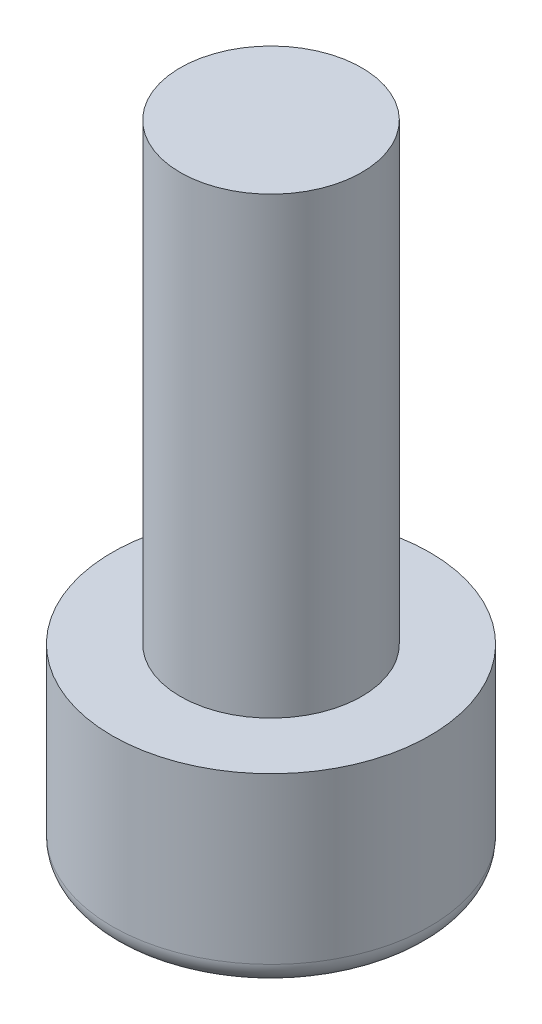
ISO-10303-21;
HEADER;
FILE_DESCRIPTION(('STEP AP214'),'2;1');
FILE_NAME('part.step','',(''),(''),'','','');
FILE_SCHEMA(('AUTOMOTIVE_DESIGN { 1 0 10303 214 1 1 1 1 }'));
ENDSEC;
DATA;
#1=APPLICATION_CONTEXT('core data for automotive mechanical design processes');
#2=APPLICATION_PROTOCOL_DEFINITION('international standard','automotive_design',2000,#1);
#3=PRODUCT_CONTEXT('',#1,'mechanical');
#4=PRODUCT('Part','Part','',(#3));
#5=PRODUCT_RELATED_PRODUCT_CATEGORY('part','',(#4));
#6=PRODUCT_DEFINITION_FORMATION('','',#4);
#7=PRODUCT_DEFINITION_CONTEXT('part definition',#1,'design');
#8=PRODUCT_DEFINITION('design','',#6,#7);
#9=PRODUCT_DEFINITION_SHAPE('','',#8);
#10=(LENGTH_UNIT() NAMED_UNIT(*) SI_UNIT(.MILLI.,.METRE.));
#11=(NAMED_UNIT(*) PLANE_ANGLE_UNIT() SI_UNIT($,.RADIAN.));
#12=(NAMED_UNIT(*) SI_UNIT($,.STERADIAN.) SOLID_ANGLE_UNIT());
#13=UNCERTAINTY_MEASURE_WITH_UNIT(LENGTH_MEASURE(1.E-05),#10,'distance_accuracy_value','');
#14=(GEOMETRIC_REPRESENTATION_CONTEXT(3) GLOBAL_UNCERTAINTY_ASSIGNED_CONTEXT((#13)) GLOBAL_UNIT_ASSIGNED_CONTEXT((#10,
#11,#12)) REPRESENTATION_CONTEXT('',''));
#15=CARTESIAN_POINT('',(0.,0.,0.));
#16=DIRECTION('',(0.,0.,1.));
#17=DIRECTION('',(1.,0.,0.));
#18=AXIS2_PLACEMENT_3D('',#15,#16,#17);
#19=CARTESIAN_POINT('',(0.,4.14,0.));
#20=DIRECTION('',(0.,-1.,0.));
#21=DIRECTION('',(0.,0.,-1.));
#22=AXIS2_PLACEMENT_3D('',#19,#20,#21);
#23=CYLINDRICAL_SURFACE('',#22,3.5);
#24=CARTESIAN_POINT('',(0.,0.5,0.));
#25=DIRECTION('',(0.,1.,0.));
#26=DIRECTION('',(0.,0.,1.));
#27=AXIS2_PLACEMENT_3D('',#24,#25,#26);
#28=CIRCLE('',#27,3.5);
#29=CARTESIAN_POINT('',(0.,0.5,3.5));
#30=VERTEX_POINT('',#29);
#31=EDGE_CURVE('E47',#30,#30,#28,.T.);
#32=ORIENTED_EDGE('',*,*,#31,.T.);
#33=EDGE_LOOP('',(#32));
#34=FACE_BOUND('',#33,.T.);
#35=CARTESIAN_POINT('',(0.,4.14,0.));
#36=DIRECTION('',(0.,1.,0.));
#37=DIRECTION('',(0.,0.,1.));
#38=AXIS2_PLACEMENT_3D('',#35,#36,#37);
#39=CIRCLE('',#38,3.5);
#40=CARTESIAN_POINT('',(0.,4.14,3.5));
#41=VERTEX_POINT('',#40);
#42=EDGE_CURVE('E149',#41,#41,#39,.T.);
#43=ORIENTED_EDGE('',*,*,#42,.F.);
#44=EDGE_LOOP('',(#43));
#45=FACE_BOUND('',#44,.T.);
#46=ADVANCED_FACE('F39',(#34,#45),#23,.T.);
#47=CARTESIAN_POINT('',(0.,4.14,0.));
#48=DIRECTION('',(0.,1.,0.));
#49=DIRECTION('',(0.,0.,1.));
#50=AXIS2_PLACEMENT_3D('',#47,#48,#49);
#51=PLANE('',#50);
#52=CARTESIAN_POINT('',(0.,4.14,0.));
#53=DIRECTION('',(0.,1.,0.));
#54=DIRECTION('',(0.,0.,1.));
#55=AXIS2_PLACEMENT_3D('',#52,#53,#54);
#56=CIRCLE('',#55,2.);
#57=CARTESIAN_POINT('',(0.,4.14,2.));
#58=VERTEX_POINT('',#57);
#59=EDGE_CURVE('E150',#58,#58,#56,.T.);
#60=ORIENTED_EDGE('',*,*,#59,.F.);
#61=EDGE_LOOP('',(#60));
#62=FACE_BOUND('',#61,.T.);
#63=ORIENTED_EDGE('',*,*,#42,.T.);
#64=EDGE_LOOP('',(#63));
#65=FACE_BOUND('',#64,.T.);
#66=ADVANCED_FACE('F174',(#62,#65),#51,.T.);
#67=CARTESIAN_POINT('',(0.,0.,0.));
#68=DIRECTION('',(0.,1.,0.));
#69=DIRECTION('',(0.,0.,1.));
#70=AXIS2_PLACEMENT_3D('',#67,#68,#69);
#71=PLANE('',#70);
#72=DIRECTION('',(-0.986123142284574,0.,0.1660155060553));
#73=VECTOR('',#72,1.);
#74=CARTESIAN_POINT('',(1.69828720758972,0.,2.05607243390784));
#75=LINE('',#74,#73);
#76=CARTESIAN_POINT('',(1.69828720758972,0.,2.05607243390784));
#77=VERTEX_POINT('',#76);
#78=CARTESIAN_POINT('',(-0.931467355990228,0.,2.49879608164875));
#79=VERTEX_POINT('',#78);
#80=EDGE_CURVE('E128',#77,#79,#75,.T.);
#81=ORIENTED_EDGE('',*,*,#80,.F.);
#82=DIRECTION('',(-0.349287925476268,0.,0.937015445505828));
#83=VECTOR('',#82,1.);
#84=CARTESIAN_POINT('',(2.62975456357995,0.,-0.442723647740915));
#85=LINE('',#84,#83);
#86=CARTESIAN_POINT('',(2.62975456357995,0.,-0.442723647740915));
#87=VERTEX_POINT('',#86);
#88=EDGE_CURVE('E54',#87,#77,#85,.T.);
#89=ORIENTED_EDGE('',*,*,#88,.F.);
#90=DIRECTION('',(0.636835216808306,0.,0.770999939450528));
#91=VECTOR('',#90,1.);
#92=CARTESIAN_POINT('',(0.931467355990229,0.,-2.49879608164875));
#93=LINE('',#92,#91);
#94=CARTESIAN_POINT('',(0.931467355990229,0.,-2.49879608164875));
#95=VERTEX_POINT('',#94);
#96=EDGE_CURVE('E137',#95,#87,#93,.T.);
#97=ORIENTED_EDGE('',*,*,#96,.F.);
#98=DIRECTION('',(0.986123142284574,0.,-0.1660155060553));
#99=VECTOR('',#98,1.);
#100=CARTESIAN_POINT('',(-1.69828720758972,0.,-2.05607243390784));
#101=LINE('',#100,#99);
#102=CARTESIAN_POINT('',(-1.69828720758972,0.,-2.05607243390784));
#103=VERTEX_POINT('',#102);
#104=EDGE_CURVE('E135',#103,#95,#101,.T.);
#105=ORIENTED_EDGE('',*,*,#104,.F.);
#106=DIRECTION('',(0.349287925476268,0.,-0.937015445505828));
#107=VECTOR('',#106,1.);
#108=CARTESIAN_POINT('',(-2.62975456357995,0.,0.442723647740914));
#109=LINE('',#108,#107);
#110=CARTESIAN_POINT('',(-2.62975456357995,0.,0.442723647740914));
#111=VERTEX_POINT('',#110);
#112=EDGE_CURVE('E102',#111,#103,#109,.T.);
#113=ORIENTED_EDGE('',*,*,#112,.F.);
#114=DIRECTION('',(-0.636835216808306,0.,-0.770999939450528));
#115=VECTOR('',#114,1.);
#116=CARTESIAN_POINT('',(-0.931467355990228,0.,2.49879608164875));
#117=LINE('',#116,#115);
#118=EDGE_CURVE('E131',#79,#111,#117,.T.);
#119=ORIENTED_EDGE('',*,*,#118,.F.);
#120=EDGE_LOOP('',(#81,#89,#97,#105,#113,#119));
#121=FACE_BOUND('',#120,.T.);
#122=CARTESIAN_POINT('',(0.,0.,0.));
#123=DIRECTION('',(0.,1.,0.));
#124=DIRECTION('',(0.,0.,1.));
#125=AXIS2_PLACEMENT_3D('',#122,#123,#124);
#126=CIRCLE('',#125,3.);
#127=CARTESIAN_POINT('',(0.,0.,3.));
#128=VERTEX_POINT('',#127);
#129=EDGE_CURVE('E11',#128,#128,#126,.F.);
#130=ORIENTED_EDGE('',*,*,#129,.T.);
#131=EDGE_LOOP('',(#130));
#132=FACE_BOUND('',#131,.T.);
#133=ADVANCED_FACE('F178',(#121,#132),#71,.F.);
#134=CARTESIAN_POINT('',(0.,14.14,0.));
#135=DIRECTION('',(0.,-1.,0.));
#136=DIRECTION('',(0.,0.,-1.));
#137=AXIS2_PLACEMENT_3D('',#134,#135,#136);
#138=CYLINDRICAL_SURFACE('',#137,2.);
#139=CARTESIAN_POINT('',(0.,14.14,0.));
#140=DIRECTION('',(0.,1.,0.));
#141=DIRECTION('',(0.,0.,1.));
#142=AXIS2_PLACEMENT_3D('',#139,#140,#141);
#143=CIRCLE('',#142,2.);
#144=CARTESIAN_POINT('',(0.,14.14,2.));
#145=VERTEX_POINT('',#144);
#146=EDGE_CURVE('E141',#145,#145,#143,.T.);
#147=ORIENTED_EDGE('',*,*,#146,.F.);
#148=EDGE_LOOP('',(#147));
#149=FACE_BOUND('',#148,.T.);
#150=ORIENTED_EDGE('',*,*,#59,.T.);
#151=EDGE_LOOP('',(#150));
#152=FACE_BOUND('',#151,.T.);
#153=ADVANCED_FACE('F169',(#149,#152),#138,.T.);
#154=CARTESIAN_POINT('',(0.,14.14,0.));
#155=DIRECTION('',(0.,1.,0.));
#156=DIRECTION('',(0.,0.,1.));
#157=AXIS2_PLACEMENT_3D('',#154,#155,#156);
#158=PLANE('',#157);
#159=ORIENTED_EDGE('',*,*,#146,.T.);
#160=EDGE_LOOP('',(#159));
#161=FACE_BOUND('',#160,.T.);
#162=ADVANCED_FACE('F161',(#161),#158,.T.);
#163=CARTESIAN_POINT('',(0.,0.5,0.));
#164=DIRECTION('',(0.,1.,0.));
#165=DIRECTION('',(0.,0.,1.));
#166=AXIS2_PLACEMENT_3D('',#163,#164,#165);
#167=TOROIDAL_SURFACE('',#166,3.,0.5);
#168=ORIENTED_EDGE('',*,*,#129,.F.);
#169=EDGE_LOOP('',(#168));
#170=FACE_BOUND('',#169,.T.);
#171=ORIENTED_EDGE('',*,*,#31,.F.);
#172=EDGE_LOOP('',(#171));
#173=FACE_BOUND('',#172,.T.);
#174=ADVANCED_FACE('F41',(#170,#173),#167,.T.);
#175=CARTESIAN_POINT('',(2.62975456357995,2.,-0.442723647740915));
#176=DIRECTION('',(0.937015445505828,0.,0.349287925476268));
#177=DIRECTION('',(0.349287925476268,0.,-0.937015445505828));
#178=AXIS2_PLACEMENT_3D('',#175,#176,#177);
#179=PLANE('',#178);
#180=ORIENTED_EDGE('',*,*,#88,.T.);
#181=DIRECTION('',(0.,-1.,0.));
#182=VECTOR('',#181,1.);
#183=CARTESIAN_POINT('',(1.69828720758972,2.,2.05607243390784));
#184=LINE('',#183,#182);
#185=CARTESIAN_POINT('',(1.69828720758972,2.,2.05607243390784));
#186=VERTEX_POINT('',#185);
#187=EDGE_CURVE('E84',#186,#77,#184,.T.);
#188=ORIENTED_EDGE('',*,*,#187,.F.);
#189=DIRECTION('',(-0.349287925476268,0.,0.937015445505828));
#190=VECTOR('',#189,1.);
#191=CARTESIAN_POINT('',(2.62975456357995,2.,-0.442723647740915));
#192=LINE('',#191,#190);
#193=CARTESIAN_POINT('',(2.62975456357995,2.,-0.442723647740915));
#194=VERTEX_POINT('',#193);
#195=EDGE_CURVE('E139',#194,#186,#192,.T.);
#196=ORIENTED_EDGE('',*,*,#195,.F.);
#197=DIRECTION('',(0.,-1.,0.));
#198=VECTOR('',#197,1.);
#199=CARTESIAN_POINT('',(2.62975456357995,2.,-0.442723647740915));
#200=LINE('',#199,#198);
#201=EDGE_CURVE('E62',#194,#87,#200,.T.);
#202=ORIENTED_EDGE('',*,*,#201,.T.);
#203=EDGE_LOOP('',(#180,#188,#196,#202));
#204=FACE_BOUND('',#203,.T.);
#205=ADVANCED_FACE('F160',(#204),#179,.F.);
#206=CARTESIAN_POINT('',(0.931467355990229,2.,-2.49879608164875));
#207=DIRECTION('',(0.770999939450528,0.,-0.636835216808306));
#208=DIRECTION('',(-0.636835216808306,0.,-0.770999939450528));
#209=AXIS2_PLACEMENT_3D('',#206,#207,#208);
#210=PLANE('',#209);
#211=ORIENTED_EDGE('',*,*,#96,.T.);
#212=ORIENTED_EDGE('',*,*,#201,.F.);
#213=DIRECTION('',(0.636835216808306,0.,0.770999939450528));
#214=VECTOR('',#213,1.);
#215=CARTESIAN_POINT('',(0.931467355990229,2.,-2.49879608164875));
#216=LINE('',#215,#214);
#217=CARTESIAN_POINT('',(0.931467355990229,2.,-2.49879608164875));
#218=VERTEX_POINT('',#217);
#219=EDGE_CURVE('E114',#218,#194,#216,.T.);
#220=ORIENTED_EDGE('',*,*,#219,.F.);
#221=DIRECTION('',(0.,-1.,0.));
#222=VECTOR('',#221,1.);
#223=CARTESIAN_POINT('',(0.931467355990229,2.,-2.49879608164875));
#224=LINE('',#223,#222);
#225=EDGE_CURVE('E106',#218,#95,#224,.T.);
#226=ORIENTED_EDGE('',*,*,#225,.T.);
#227=EDGE_LOOP('',(#211,#212,#220,#226));
#228=FACE_BOUND('',#227,.T.);
#229=ADVANCED_FACE('F167',(#228),#210,.F.);
#230=CARTESIAN_POINT('',(-1.69828720758972,2.,-2.05607243390784));
#231=DIRECTION('',(-0.1660155060553,0.,-0.986123142284574));
#232=DIRECTION('',(-0.986123142284574,0.,0.1660155060553));
#233=AXIS2_PLACEMENT_3D('',#230,#231,#232);
#234=PLANE('',#233);
#235=ORIENTED_EDGE('',*,*,#104,.T.);
#236=ORIENTED_EDGE('',*,*,#225,.F.);
#237=DIRECTION('',(0.986123142284574,0.,-0.1660155060553));
#238=VECTOR('',#237,1.);
#239=CARTESIAN_POINT('',(-1.69828720758972,2.,-2.05607243390784));
#240=LINE('',#239,#238);
#241=CARTESIAN_POINT('',(-1.69828720758972,2.,-2.05607243390784));
#242=VERTEX_POINT('',#241);
#243=EDGE_CURVE('E110',#242,#218,#240,.T.);
#244=ORIENTED_EDGE('',*,*,#243,.F.);
#245=DIRECTION('',(0.,-1.,0.));
#246=VECTOR('',#245,1.);
#247=CARTESIAN_POINT('',(-1.69828720758972,2.,-2.05607243390784));
#248=LINE('',#247,#246);
#249=EDGE_CURVE('E95',#242,#103,#248,.T.);
#250=ORIENTED_EDGE('',*,*,#249,.T.);
#251=EDGE_LOOP('',(#235,#236,#244,#250));
#252=FACE_BOUND('',#251,.T.);
#253=ADVANCED_FACE('F111',(#252),#234,.F.);
#254=CARTESIAN_POINT('',(-2.62975456357995,2.,0.442723647740914));
#255=DIRECTION('',(-0.937015445505828,0.,-0.349287925476268));
#256=DIRECTION('',(-0.349287925476268,0.,0.937015445505828));
#257=AXIS2_PLACEMENT_3D('',#254,#255,#256);
#258=PLANE('',#257);
#259=ORIENTED_EDGE('',*,*,#112,.T.);
#260=ORIENTED_EDGE('',*,*,#249,.F.);
#261=DIRECTION('',(0.349287925476268,0.,-0.937015445505828));
#262=VECTOR('',#261,1.);
#263=CARTESIAN_POINT('',(-2.62975456357995,2.,0.442723647740914));
#264=LINE('',#263,#262);
#265=CARTESIAN_POINT('',(-2.62975456357995,2.,0.442723647740914));
#266=VERTEX_POINT('',#265);
#267=EDGE_CURVE('E99',#266,#242,#264,.T.);
#268=ORIENTED_EDGE('',*,*,#267,.F.);
#269=DIRECTION('',(0.,-1.,0.));
#270=VECTOR('',#269,1.);
#271=CARTESIAN_POINT('',(-2.62975456357995,2.,0.442723647740914));
#272=LINE('',#271,#270);
#273=EDGE_CURVE('E107',#266,#111,#272,.T.);
#274=ORIENTED_EDGE('',*,*,#273,.T.);
#275=EDGE_LOOP('',(#259,#260,#268,#274));
#276=FACE_BOUND('',#275,.T.);
#277=ADVANCED_FACE('F97',(#276),#258,.F.);
#278=CARTESIAN_POINT('',(-0.931467355990228,2.,2.49879608164875));
#279=DIRECTION('',(-0.770999939450528,0.,0.636835216808306));
#280=DIRECTION('',(0.636835216808306,0.,0.770999939450528));
#281=AXIS2_PLACEMENT_3D('',#278,#279,#280);
#282=PLANE('',#281);
#283=ORIENTED_EDGE('',*,*,#118,.T.);
#284=ORIENTED_EDGE('',*,*,#273,.F.);
#285=DIRECTION('',(-0.636835216808306,0.,-0.770999939450528));
#286=VECTOR('',#285,1.);
#287=CARTESIAN_POINT('',(-0.931467355990228,2.,2.49879608164875));
#288=LINE('',#287,#286);
#289=CARTESIAN_POINT('',(-0.931467355990228,2.,2.49879608164875));
#290=VERTEX_POINT('',#289);
#291=EDGE_CURVE('E120',#290,#266,#288,.T.);
#292=ORIENTED_EDGE('',*,*,#291,.F.);
#293=DIRECTION('',(0.,-1.,0.));
#294=VECTOR('',#293,1.);
#295=CARTESIAN_POINT('',(-0.931467355990228,2.,2.49879608164875));
#296=LINE('',#295,#294);
#297=EDGE_CURVE('E144',#290,#79,#296,.T.);
#298=ORIENTED_EDGE('',*,*,#297,.T.);
#299=EDGE_LOOP('',(#283,#284,#292,#298));
#300=FACE_BOUND('',#299,.T.);
#301=ADVANCED_FACE('F191',(#300),#282,.F.);
#302=CARTESIAN_POINT('',(1.69828720758972,2.,2.05607243390784));
#303=DIRECTION('',(0.1660155060553,0.,0.986123142284574));
#304=DIRECTION('',(0.986123142284574,0.,-0.1660155060553));
#305=AXIS2_PLACEMENT_3D('',#302,#303,#304);
#306=PLANE('',#305);
#307=ORIENTED_EDGE('',*,*,#80,.T.);
#308=ORIENTED_EDGE('',*,*,#297,.F.);
#309=DIRECTION('',(-0.986123142284574,0.,0.1660155060553));
#310=VECTOR('',#309,1.);
#311=CARTESIAN_POINT('',(1.69828720758972,2.,2.05607243390784));
#312=LINE('',#311,#310);
#313=EDGE_CURVE('E122',#186,#290,#312,.T.);
#314=ORIENTED_EDGE('',*,*,#313,.F.);
#315=ORIENTED_EDGE('',*,*,#187,.T.);
#316=EDGE_LOOP('',(#307,#308,#314,#315));
#317=FACE_BOUND('',#316,.T.);
#318=ADVANCED_FACE('F188',(#317),#306,.F.);
#319=CARTESIAN_POINT('',(0.,2.,0.));
#320=DIRECTION('',(0.,-1.,0.));
#321=DIRECTION('',(0.,0.,-1.));
#322=AXIS2_PLACEMENT_3D('',#319,#320,#321);
#323=PLANE('',#322);
#324=ORIENTED_EDGE('',*,*,#195,.T.);
#325=ORIENTED_EDGE('',*,*,#313,.T.);
#326=ORIENTED_EDGE('',*,*,#291,.T.);
#327=ORIENTED_EDGE('',*,*,#267,.T.);
#328=ORIENTED_EDGE('',*,*,#243,.T.);
#329=ORIENTED_EDGE('',*,*,#219,.T.);
#330=EDGE_LOOP('',(#324,#325,#326,#327,#328,#329));
#331=FACE_BOUND('',#330,.T.);
#332=ADVANCED_FACE('F117',(#331),#323,.T.);
#333=CLOSED_SHELL('',(#46,#66,#133,#153,#162,#174,#205,#229,#253,#277,#301,#318,#332));
#334=MANIFOLD_SOLID_BREP('B2',#333);
#335=ADVANCED_BREP_SHAPE_REPRESENTATION('',(#18,#334),#14);
#336=SHAPE_DEFINITION_REPRESENTATION(#9,#335);
ENDSEC;
END-ISO-10303-21;
